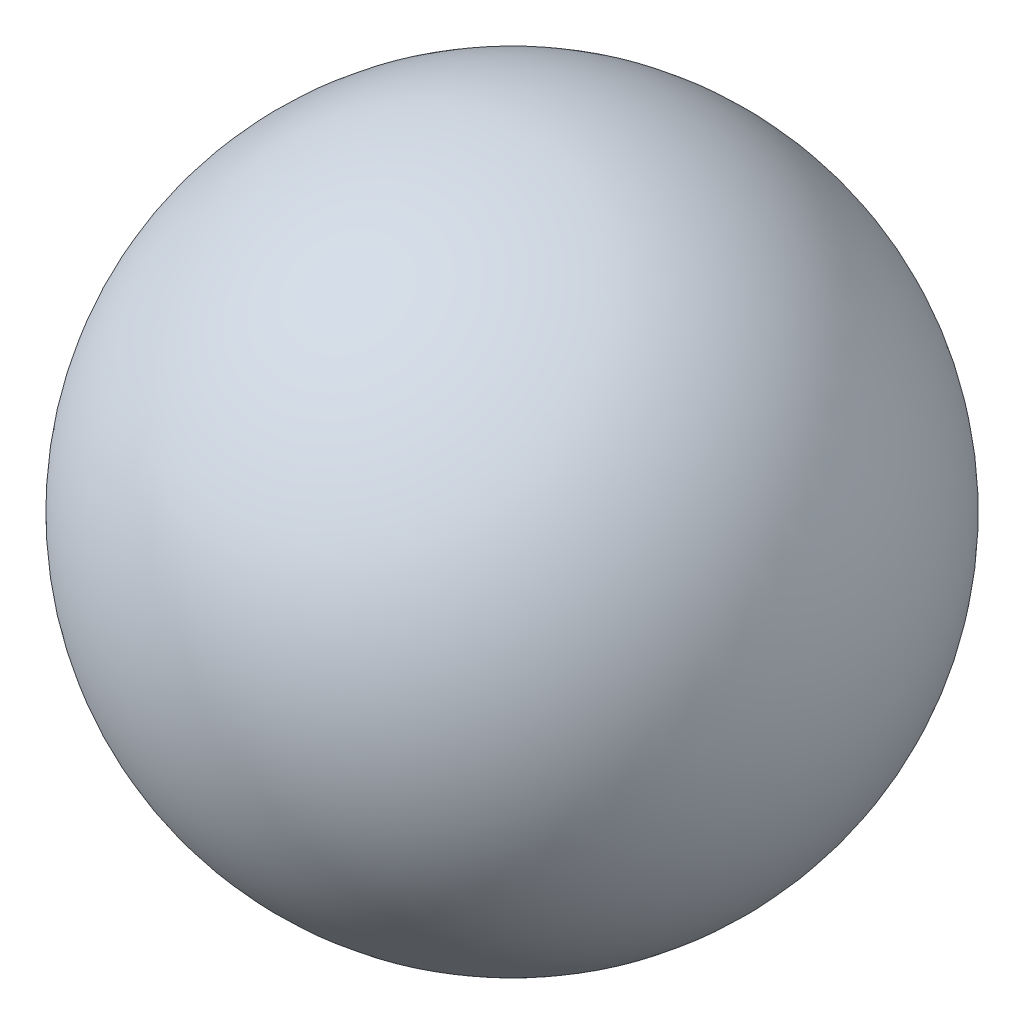
ISO-10303-21;
HEADER;
FILE_DESCRIPTION(('STEP AP214'),'2;1');
FILE_NAME('part.step','',(''),(''),'','','');
FILE_SCHEMA(('AUTOMOTIVE_DESIGN { 1 0 10303 214 1 1 1 1 }'));
ENDSEC;
DATA;
#1=APPLICATION_CONTEXT('core data for automotive mechanical design processes');
#2=APPLICATION_PROTOCOL_DEFINITION('international standard','automotive_design',2000,#1);
#3=PRODUCT_CONTEXT('',#1,'mechanical');
#4=PRODUCT('Part','Part','',(#3));
#5=PRODUCT_RELATED_PRODUCT_CATEGORY('part','',(#4));
#6=PRODUCT_DEFINITION_FORMATION('','',#4);
#7=PRODUCT_DEFINITION_CONTEXT('part definition',#1,'design');
#8=PRODUCT_DEFINITION('design','',#6,#7);
#9=PRODUCT_DEFINITION_SHAPE('','',#8);
#10=(LENGTH_UNIT() NAMED_UNIT(*) SI_UNIT(.MILLI.,.METRE.));
#11=(NAMED_UNIT(*) PLANE_ANGLE_UNIT() SI_UNIT($,.RADIAN.));
#12=(NAMED_UNIT(*) SI_UNIT($,.STERADIAN.) SOLID_ANGLE_UNIT());
#13=UNCERTAINTY_MEASURE_WITH_UNIT(LENGTH_MEASURE(1.E-05),#10,'distance_accuracy_value','');
#14=(GEOMETRIC_REPRESENTATION_CONTEXT(3) GLOBAL_UNCERTAINTY_ASSIGNED_CONTEXT((#13)) GLOBAL_UNIT_ASSIGNED_CONTEXT((#10,
#11,#12)) REPRESENTATION_CONTEXT('',''));
#15=CARTESIAN_POINT('',(0.,0.,0.));
#16=DIRECTION('',(0.,0.,1.));
#17=DIRECTION('',(1.,0.,0.));
#18=AXIS2_PLACEMENT_3D('',#15,#16,#17);
#19=CARTESIAN_POINT('',(0.,0.75,0.));
#20=DIRECTION('',(0.,1.,0.));
#21=DIRECTION('',(1.,0.,0.));
#22=AXIS2_PLACEMENT_3D('',#19,#20,#21);
#23=SPHERICAL_SURFACE('',#22,0.75);
#24=CARTESIAN_POINT('',(0.,1.5,0.));
#25=VERTEX_POINT('',#24);
#26=VERTEX_LOOP('',#25);
#27=FACE_BOUND('',#26,.T.);
#28=ADVANCED_FACE('F30',(#27),#23,.T.);
#29=CLOSED_SHELL('',(#28));
#30=MANIFOLD_SOLID_BREP('B2',#29);
#31=ADVANCED_BREP_SHAPE_REPRESENTATION('',(#18,#30),#14);
#32=SHAPE_DEFINITION_REPRESENTATION(#9,#31);
ENDSEC;
END-ISO-10303-21;
